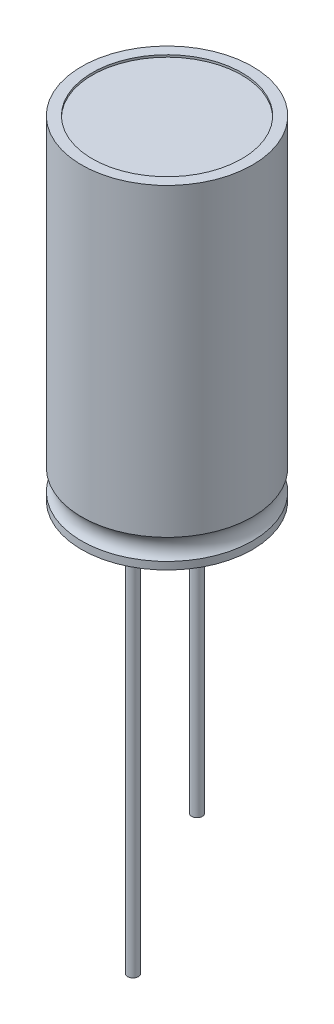
ISO-10303-21;
HEADER;
FILE_DESCRIPTION(('STEP AP214'),'2;1');
FILE_NAME('part.step','',(''),(''),'','','');
FILE_SCHEMA(('AUTOMOTIVE_DESIGN { 1 0 10303 214 1 1 1 1 }'));
ENDSEC;
DATA;
#1=APPLICATION_CONTEXT('core data for automotive mechanical design processes');
#2=APPLICATION_PROTOCOL_DEFINITION('international standard','automotive_design',2000,#1);
#3=PRODUCT_CONTEXT('',#1,'mechanical');
#4=PRODUCT('Part','Part','',(#3));
#5=PRODUCT_RELATED_PRODUCT_CATEGORY('part','',(#4));
#6=PRODUCT_DEFINITION_FORMATION('','',#4);
#7=PRODUCT_DEFINITION_CONTEXT('part definition',#1,'design');
#8=PRODUCT_DEFINITION('design','',#6,#7);
#9=PRODUCT_DEFINITION_SHAPE('','',#8);
#10=(LENGTH_UNIT() NAMED_UNIT(*) SI_UNIT(.MILLI.,.METRE.));
#11=(NAMED_UNIT(*) PLANE_ANGLE_UNIT() SI_UNIT($,.RADIAN.));
#12=(NAMED_UNIT(*) SI_UNIT($,.STERADIAN.) SOLID_ANGLE_UNIT());
#13=UNCERTAINTY_MEASURE_WITH_UNIT(LENGTH_MEASURE(1.E-05),#10,'distance_accuracy_value','');
#14=(GEOMETRIC_REPRESENTATION_CONTEXT(3) GLOBAL_UNCERTAINTY_ASSIGNED_CONTEXT((#13)) GLOBAL_UNIT_ASSIGNED_CONTEXT((#10,
#11,#12)) REPRESENTATION_CONTEXT('',''));
#15=CARTESIAN_POINT('',(0.,0.,0.));
#16=DIRECTION('',(0.,0.,1.));
#17=DIRECTION('',(1.,0.,0.));
#18=AXIS2_PLACEMENT_3D('',#15,#16,#17);
#19=CARTESIAN_POINT('',(0.,0.837019609469986,0.));
#20=DIRECTION('',(0.,-1.,0.));
#21=DIRECTION('',(1.,0.,0.));
#22=AXIS2_PLACEMENT_3D('',#19,#20,#21);
#23=TOROIDAL_SURFACE('',#22,4.48734132389534,0.689204709757652);
#24=CARTESIAN_POINT('',(0.,0.349678285574644,0.));
#25=DIRECTION('',(0.,-1.,0.));
#26=DIRECTION('',(1.,0.,0.));
#27=AXIS2_PLACEMENT_3D('',#24,#25,#26);
#28=CIRCLE('',#27,4.);
#29=CARTESIAN_POINT('',(4.,0.349678285574645,0.));
#30=VERTEX_POINT('',#29);
#31=EDGE_CURVE('E73',#30,#30,#28,.T.);
#32=ORIENTED_EDGE('',*,*,#31,.F.);
#33=EDGE_LOOP('',(#32));
#34=FACE_BOUND('',#33,.T.);
#35=CARTESIAN_POINT('',(0.,1.32436093336533,0.));
#36=DIRECTION('',(0.,-1.,0.));
#37=DIRECTION('',(1.,0.,0.));
#38=AXIS2_PLACEMENT_3D('',#35,#36,#37);
#39=CIRCLE('',#38,4.);
#40=CARTESIAN_POINT('',(4.,1.32436093336533,0.));
#41=VERTEX_POINT('',#40);
#42=EDGE_CURVE('E49',#41,#41,#39,.T.);
#43=ORIENTED_EDGE('',*,*,#42,.T.);
#44=EDGE_LOOP('',(#43));
#45=FACE_BOUND('',#44,.T.);
#46=ADVANCED_FACE('F42',(#34,#45),#23,.F.);
#47=CARTESIAN_POINT('',(0.,0.,0.));
#48=DIRECTION('',(0.,-1.,0.));
#49=DIRECTION('',(1.,0.,0.));
#50=AXIS2_PLACEMENT_3D('',#47,#48,#49);
#51=CYLINDRICAL_SURFACE('',#50,4.);
#52=CARTESIAN_POINT('',(0.,15.6,0.));
#53=DIRECTION('',(0.,-1.,0.));
#54=DIRECTION('',(1.,0.,0.));
#55=AXIS2_PLACEMENT_3D('',#52,#53,#54);
#56=CIRCLE('',#55,4.);
#57=CARTESIAN_POINT('',(4.,15.6,0.));
#58=VERTEX_POINT('',#57);
#59=EDGE_CURVE('E53',#58,#58,#56,.T.);
#60=ORIENTED_EDGE('',*,*,#59,.T.);
#61=EDGE_LOOP('',(#60));
#62=FACE_BOUND('',#61,.T.);
#63=ORIENTED_EDGE('',*,*,#42,.F.);
#64=EDGE_LOOP('',(#63));
#65=FACE_BOUND('',#64,.T.);
#66=ADVANCED_FACE('F122',(#62,#65),#51,.T.);
#67=CARTESIAN_POINT('',(0.,15.6,0.));
#68=DIRECTION('',(0.,-1.,0.));
#69=DIRECTION('',(1.,0.,0.));
#70=AXIS2_PLACEMENT_3D('',#67,#68,#69);
#71=PLANE('',#70);
#72=ORIENTED_EDGE('',*,*,#59,.F.);
#73=EDGE_LOOP('',(#72));
#74=FACE_BOUND('',#73,.T.);
#75=CARTESIAN_POINT('',(0.,15.6,0.));
#76=DIRECTION('',(0.,-1.,0.));
#77=DIRECTION('',(1.,0.,0.));
#78=AXIS2_PLACEMENT_3D('',#75,#76,#77);
#79=CIRCLE('',#78,3.5);
#80=CARTESIAN_POINT('',(3.5,15.6,0.));
#81=VERTEX_POINT('',#80);
#82=EDGE_CURVE('E59',#81,#81,#79,.T.);
#83=ORIENTED_EDGE('',*,*,#82,.T.);
#84=EDGE_LOOP('',(#83));
#85=FACE_BOUND('',#84,.T.);
#86=ADVANCED_FACE('F126',(#74,#85),#71,.F.);
#87=CARTESIAN_POINT('',(0.,0.,0.));
#88=DIRECTION('',(0.,-1.,0.));
#89=DIRECTION('',(1.,0.,0.));
#90=AXIS2_PLACEMENT_3D('',#87,#88,#89);
#91=CYLINDRICAL_SURFACE('',#90,3.5);
#92=CARTESIAN_POINT('',(0.,15.5,0.));
#93=DIRECTION('',(0.,-1.,0.));
#94=DIRECTION('',(1.,0.,0.));
#95=AXIS2_PLACEMENT_3D('',#92,#93,#94);
#96=CIRCLE('',#95,3.5);
#97=CARTESIAN_POINT('',(3.5,15.5,0.));
#98=VERTEX_POINT('',#97);
#99=EDGE_CURVE('E62',#98,#98,#96,.T.);
#100=ORIENTED_EDGE('',*,*,#99,.T.);
#101=EDGE_LOOP('',(#100));
#102=FACE_BOUND('',#101,.T.);
#103=ORIENTED_EDGE('',*,*,#82,.F.);
#104=EDGE_LOOP('',(#103));
#105=FACE_BOUND('',#104,.T.);
#106=ADVANCED_FACE('F136',(#102,#105),#91,.F.);
#107=CARTESIAN_POINT('',(0.,15.5,0.));
#108=DIRECTION('',(0.,-1.,0.));
#109=DIRECTION('',(1.,0.,0.));
#110=AXIS2_PLACEMENT_3D('',#107,#108,#109);
#111=PLANE('',#110);
#112=ORIENTED_EDGE('',*,*,#99,.F.);
#113=EDGE_LOOP('',(#112));
#114=FACE_BOUND('',#113,.T.);
#115=ADVANCED_FACE('F101',(#114),#111,.F.);
#116=CARTESIAN_POINT('',(0.,0.0999999999999998,0.));
#117=DIRECTION('',(0.,-1.,0.));
#118=DIRECTION('',(1.,0.,0.));
#119=AXIS2_PLACEMENT_3D('',#116,#117,#118);
#120=PLANE('',#119);
#121=CARTESIAN_POINT('',(-1.5,0.0999999999999996,0.0947304258705397));
#122=DIRECTION('',(0.,-1.,0.));
#123=DIRECTION('',(1.,0.,0.));
#124=AXIS2_PLACEMENT_3D('',#121,#122,#123);
#125=CIRCLE('',#124,0.25);
#126=CARTESIAN_POINT('',(-1.25,0.0999999999999997,0.0947304258705397));
#127=VERTEX_POINT('',#126);
#128=EDGE_CURVE('E82',#127,#127,#125,.T.);
#129=ORIENTED_EDGE('',*,*,#128,.F.);
#130=EDGE_LOOP('',(#129));
#131=FACE_BOUND('',#130,.T.);
#132=CARTESIAN_POINT('',(1.5,0.1,0.0947304258705397));
#133=DIRECTION('',(0.,-1.,0.));
#134=DIRECTION('',(1.,0.,0.));
#135=AXIS2_PLACEMENT_3D('',#132,#133,#134);
#136=CIRCLE('',#135,0.25);
#137=CARTESIAN_POINT('',(1.75,0.1,0.0947304258705397));
#138=VERTEX_POINT('',#137);
#139=EDGE_CURVE('E80',#138,#138,#136,.T.);
#140=ORIENTED_EDGE('',*,*,#139,.F.);
#141=EDGE_LOOP('',(#140));
#142=FACE_BOUND('',#141,.T.);
#143=CARTESIAN_POINT('',(0.,0.0999999999999996,0.));
#144=DIRECTION('',(0.,-1.,0.));
#145=DIRECTION('',(1.,0.,0.));
#146=AXIS2_PLACEMENT_3D('',#143,#144,#145);
#147=CIRCLE('',#146,3.5);
#148=CARTESIAN_POINT('',(3.5,0.1,0.));
#149=VERTEX_POINT('',#148);
#150=EDGE_CURVE('E66',#149,#149,#147,.T.);
#151=ORIENTED_EDGE('',*,*,#150,.T.);
#152=EDGE_LOOP('',(#151));
#153=FACE_BOUND('',#152,.T.);
#154=ADVANCED_FACE('F100',(#131,#142,#153),#120,.T.);
#155=CARTESIAN_POINT('',(0.,0.,0.));
#156=DIRECTION('',(0.,-1.,0.));
#157=DIRECTION('',(1.,0.,0.));
#158=AXIS2_PLACEMENT_3D('',#155,#156,#157);
#159=CYLINDRICAL_SURFACE('',#158,3.5);
#160=ORIENTED_EDGE('',*,*,#150,.F.);
#161=EDGE_LOOP('',(#160));
#162=FACE_BOUND('',#161,.T.);
#163=CARTESIAN_POINT('',(0.,0.,0.));
#164=DIRECTION('',(0.,-1.,0.));
#165=DIRECTION('',(1.,0.,0.));
#166=AXIS2_PLACEMENT_3D('',#163,#164,#165);
#167=CIRCLE('',#166,3.5);
#168=CARTESIAN_POINT('',(3.5,0.,0.));
#169=VERTEX_POINT('',#168);
#170=EDGE_CURVE('E68',#169,#169,#167,.T.);
#171=ORIENTED_EDGE('',*,*,#170,.T.);
#172=EDGE_LOOP('',(#171));
#173=FACE_BOUND('',#172,.T.);
#174=ADVANCED_FACE('F99',(#162,#173),#159,.F.);
#175=CARTESIAN_POINT('',(0.,0.,0.));
#176=DIRECTION('',(0.,-1.,0.));
#177=DIRECTION('',(1.,0.,0.));
#178=AXIS2_PLACEMENT_3D('',#175,#176,#177);
#179=PLANE('',#178);
#180=CARTESIAN_POINT('',(0.,0.,0.));
#181=DIRECTION('',(0.,-1.,0.));
#182=DIRECTION('',(1.,0.,0.));
#183=AXIS2_PLACEMENT_3D('',#180,#181,#182);
#184=CIRCLE('',#183,4.);
#185=CARTESIAN_POINT('',(4.,0.,0.));
#186=VERTEX_POINT('',#185);
#187=EDGE_CURVE('E75',#186,#186,#184,.T.);
#188=ORIENTED_EDGE('',*,*,#187,.T.);
#189=EDGE_LOOP('',(#188));
#190=FACE_BOUND('',#189,.T.);
#191=ORIENTED_EDGE('',*,*,#170,.F.);
#192=EDGE_LOOP('',(#191));
#193=FACE_BOUND('',#192,.T.);
#194=ADVANCED_FACE('F108',(#190,#193),#179,.T.);
#195=ORIENTED_EDGE('',*,*,#31,.T.);
#196=EDGE_LOOP('',(#195));
#197=FACE_BOUND('',#196,.T.);
#198=ORIENTED_EDGE('',*,*,#187,.F.);
#199=EDGE_LOOP('',(#198));
#200=FACE_BOUND('',#199,.T.);
#201=ADVANCED_FACE('F111',(#197,#200),#51,.T.);
#202=CARTESIAN_POINT('',(1.5,-19.9,0.0947304258705397));
#203=DIRECTION('',(0.,1.,0.));
#204=DIRECTION('',(-1.,0.,0.));
#205=AXIS2_PLACEMENT_3D('',#202,#203,#204);
#206=CYLINDRICAL_SURFACE('',#205,0.25);
#207=CARTESIAN_POINT('',(1.5,-11.9,0.0947304258705397));
#208=DIRECTION('',(0.,1.,0.));
#209=DIRECTION('',(0.,0.,1.));
#210=AXIS2_PLACEMENT_3D('',#207,#208,#209);
#211=CIRCLE('',#210,0.25);
#212=CARTESIAN_POINT('',(1.5,-11.9,0.34473042587054));
#213=VERTEX_POINT('',#212);
#214=EDGE_CURVE('E10',#213,#213,#211,.T.);
#215=ORIENTED_EDGE('',*,*,#214,.T.);
#216=EDGE_LOOP('',(#215));
#217=FACE_BOUND('',#216,.T.);
#218=ORIENTED_EDGE('',*,*,#139,.T.);
#219=EDGE_LOOP('',(#218));
#220=FACE_BOUND('',#219,.T.);
#221=ADVANCED_FACE('F91',(#217,#220),#206,.T.);
#222=CARTESIAN_POINT('',(-1.5,-19.9,0.0947304258705397));
#223=DIRECTION('',(0.,1.,0.));
#224=DIRECTION('',(-1.,0.,0.));
#225=AXIS2_PLACEMENT_3D('',#222,#223,#224);
#226=CYLINDRICAL_SURFACE('',#225,0.25);
#227=CARTESIAN_POINT('',(-1.5,-19.9,0.0947304258705397));
#228=DIRECTION('',(0.,-1.,0.));
#229=DIRECTION('',(1.,0.,0.));
#230=AXIS2_PLACEMENT_3D('',#227,#228,#229);
#231=CIRCLE('',#230,0.25);
#232=CARTESIAN_POINT('',(-1.25,-19.9,0.0947304258705397));
#233=VERTEX_POINT('',#232);
#234=EDGE_CURVE('E77',#233,#233,#231,.T.);
#235=ORIENTED_EDGE('',*,*,#234,.F.);
#236=EDGE_LOOP('',(#235));
#237=FACE_BOUND('',#236,.T.);
#238=ORIENTED_EDGE('',*,*,#128,.T.);
#239=EDGE_LOOP('',(#238));
#240=FACE_BOUND('',#239,.T.);
#241=ADVANCED_FACE('F89',(#237,#240),#226,.T.);
#242=CARTESIAN_POINT('',(0.,-19.9,0.));
#243=DIRECTION('',(0.,-1.,0.));
#244=DIRECTION('',(1.,0.,0.));
#245=AXIS2_PLACEMENT_3D('',#242,#243,#244);
#246=PLANE('',#245);
#247=ORIENTED_EDGE('',*,*,#234,.T.);
#248=EDGE_LOOP('',(#247));
#249=FACE_BOUND('',#248,.T.);
#250=ADVANCED_FACE('F86',(#249),#246,.T.);
#251=CARTESIAN_POINT('',(1.25,-11.9,-4.));
#252=DIRECTION('',(0.,1.,0.));
#253=DIRECTION('',(0.,0.,1.));
#254=AXIS2_PLACEMENT_3D('',#251,#252,#253);
#255=PLANE('',#254);
#256=ORIENTED_EDGE('',*,*,#214,.F.);
#257=EDGE_LOOP('',(#256));
#258=FACE_BOUND('',#257,.T.);
#259=ADVANCED_FACE('F145',(#258),#255,.F.);
#260=CLOSED_SHELL('',(#46,#66,#86,#106,#115,#154,#174,#194,#201,#221,#241,#250,#259));
#261=MANIFOLD_SOLID_BREP('B2',#260);
#262=ADVANCED_BREP_SHAPE_REPRESENTATION('',(#18,#261),#14);
#263=SHAPE_DEFINITION_REPRESENTATION(#9,#262);
ENDSEC;
END-ISO-10303-21;
